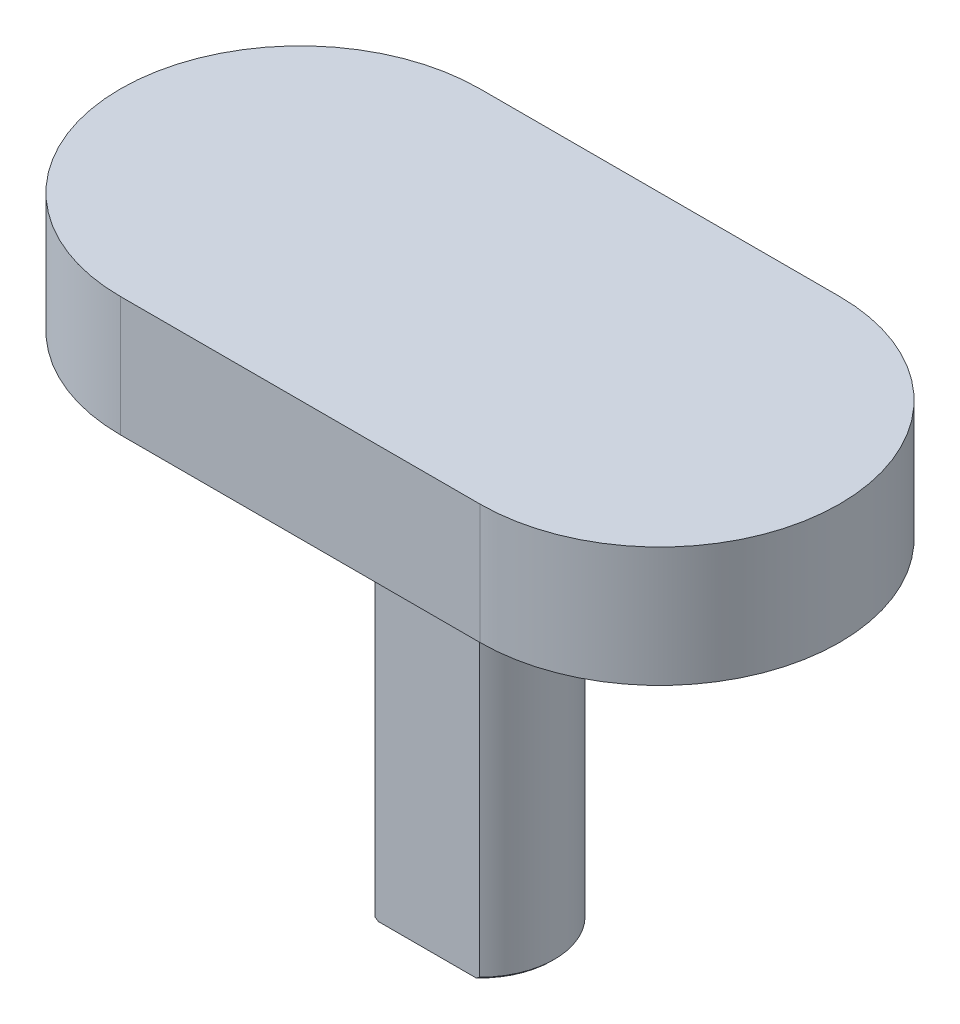
ISO-10303-21;
HEADER;
FILE_DESCRIPTION(('STEP AP214'),'2;1');
FILE_NAME('part.step','',(''),(''),'','','');
FILE_SCHEMA(('AUTOMOTIVE_DESIGN { 1 0 10303 214 1 1 1 1 }'));
ENDSEC;
DATA;
#1=APPLICATION_CONTEXT('core data for automotive mechanical design processes');
#2=APPLICATION_PROTOCOL_DEFINITION('international standard','automotive_design',2000,#1);
#3=PRODUCT_CONTEXT('',#1,'mechanical');
#4=PRODUCT('Part','Part','',(#3));
#5=PRODUCT_RELATED_PRODUCT_CATEGORY('part','',(#4));
#6=PRODUCT_DEFINITION_FORMATION('','',#4);
#7=PRODUCT_DEFINITION_CONTEXT('part definition',#1,'design');
#8=PRODUCT_DEFINITION('design','',#6,#7);
#9=PRODUCT_DEFINITION_SHAPE('','',#8);
#10=(LENGTH_UNIT() NAMED_UNIT(*) SI_UNIT(.MILLI.,.METRE.));
#11=(NAMED_UNIT(*) PLANE_ANGLE_UNIT() SI_UNIT($,.RADIAN.));
#12=(NAMED_UNIT(*) SI_UNIT($,.STERADIAN.) SOLID_ANGLE_UNIT());
#13=UNCERTAINTY_MEASURE_WITH_UNIT(LENGTH_MEASURE(1.E-05),#10,'distance_accuracy_value','');
#14=(GEOMETRIC_REPRESENTATION_CONTEXT(3) GLOBAL_UNCERTAINTY_ASSIGNED_CONTEXT((#13)) GLOBAL_UNIT_ASSIGNED_CONTEXT((#10,
#11,#12)) REPRESENTATION_CONTEXT('',''));
#15=CARTESIAN_POINT('',(0.,0.,0.));
#16=DIRECTION('',(0.,0.,1.));
#17=DIRECTION('',(1.,0.,0.));
#18=AXIS2_PLACEMENT_3D('',#15,#16,#17);
#19=CARTESIAN_POINT('',(75.,40.,0.));
#20=DIRECTION('',(0.,-1.,0.));
#21=DIRECTION('',(0.,0.,-1.));
#22=AXIS2_PLACEMENT_3D('',#19,#20,#21);
#23=PLANE('',#22);
#24=CARTESIAN_POINT('',(75.,40.,0.));
#25=DIRECTION('',(0.,-1.,0.));
#26=DIRECTION('',(0.,0.,-1.));
#27=AXIS2_PLACEMENT_3D('',#24,#25,#26);
#28=CIRCLE('',#27,65.);
#29=CARTESIAN_POINT('',(75.,40.,-65.));
#30=VERTEX_POINT('',#29);
#31=CARTESIAN_POINT('',(75.,40.,65.));
#32=VERTEX_POINT('',#31);
#33=EDGE_CURVE('E300',#30,#32,#28,.T.);
#34=ORIENTED_EDGE('',*,*,#33,.T.);
#35=DIRECTION('',(-1.,0.,0.));
#36=VECTOR('',#35,1.);
#37=CARTESIAN_POINT('',(-75.,40.,65.));
#38=LINE('',#37,#36);
#39=CARTESIAN_POINT('',(-75.,40.,65.));
#40=VERTEX_POINT('',#39);
#41=EDGE_CURVE('E303',#32,#40,#38,.T.);
#42=ORIENTED_EDGE('',*,*,#41,.T.);
#43=CARTESIAN_POINT('',(-75.,40.,0.));
#44=DIRECTION('',(0.,-1.,0.));
#45=DIRECTION('',(0.,0.,-1.));
#46=AXIS2_PLACEMENT_3D('',#43,#44,#45);
#47=CIRCLE('',#46,65.);
#48=CARTESIAN_POINT('',(-75.,40.,-65.));
#49=VERTEX_POINT('',#48);
#50=EDGE_CURVE('E307',#40,#49,#47,.T.);
#51=ORIENTED_EDGE('',*,*,#50,.T.);
#52=DIRECTION('',(1.,0.,0.));
#53=VECTOR('',#52,1.);
#54=CARTESIAN_POINT('',(-75.,40.,-65.));
#55=LINE('',#54,#53);
#56=EDGE_CURVE('E310',#49,#30,#55,.T.);
#57=ORIENTED_EDGE('',*,*,#56,.T.);
#58=EDGE_LOOP('',(#34,#42,#51,#57));
#59=FACE_BOUND('',#58,.T.);
#60=DIRECTION('',(1.,0.,0.));
#61=VECTOR('',#60,1.);
#62=CARTESIAN_POINT('',(-24.9198715887542,40.,-30.));
#63=LINE('',#62,#61);
#64=CARTESIAN_POINT('',(-24.9198715887542,40.,-30.));
#65=VERTEX_POINT('',#64);
#66=CARTESIAN_POINT('',(24.9198715887542,40.,-30.));
#67=VERTEX_POINT('',#66);
#68=EDGE_CURVE('E284',#65,#67,#63,.T.);
#69=ORIENTED_EDGE('',*,*,#68,.F.);
#70=CARTESIAN_POINT('',(0.,40.,0.));
#71=DIRECTION('',(0.,-1.,0.));
#72=DIRECTION('',(0.,0.,-1.));
#73=AXIS2_PLACEMENT_3D('',#70,#71,#72);
#74=CIRCLE('',#73,39.);
#75=CARTESIAN_POINT('',(-24.9198715887542,40.,30.));
#76=VERTEX_POINT('',#75);
#77=EDGE_CURVE('E270',#76,#65,#74,.T.);
#78=ORIENTED_EDGE('',*,*,#77,.F.);
#79=DIRECTION('',(-1.,0.,0.));
#80=VECTOR('',#79,1.);
#81=CARTESIAN_POINT('',(-24.9198715887542,40.,30.));
#82=LINE('',#81,#80);
#83=CARTESIAN_POINT('',(24.9198715887542,40.,30.));
#84=VERTEX_POINT('',#83);
#85=EDGE_CURVE('E275',#84,#76,#82,.T.);
#86=ORIENTED_EDGE('',*,*,#85,.F.);
#87=CARTESIAN_POINT('',(0.,40.,0.));
#88=DIRECTION('',(0.,-1.,0.));
#89=DIRECTION('',(0.,0.,-1.));
#90=AXIS2_PLACEMENT_3D('',#87,#88,#89);
#91=CIRCLE('',#90,39.);
#92=EDGE_CURVE('E286',#67,#84,#91,.T.);
#93=ORIENTED_EDGE('',*,*,#92,.F.);
#94=EDGE_LOOP('',(#69,#78,#86,#93));
#95=FACE_BOUND('',#94,.T.);
#96=ADVANCED_FACE('F44',(#59,#95),#23,.T.);
#97=CARTESIAN_POINT('',(75.,50.,0.));
#98=DIRECTION('',(0.,-1.,0.));
#99=DIRECTION('',(0.,0.,-1.));
#100=AXIS2_PLACEMENT_3D('',#97,#98,#99);
#101=CYLINDRICAL_SURFACE('',#100,75.);
#102=CARTESIAN_POINT('',(75.,0.,0.));
#103=DIRECTION('',(0.,1.,0.));
#104=DIRECTION('',(0.,0.,1.));
#105=AXIS2_PLACEMENT_3D('',#102,#103,#104);
#106=CIRCLE('',#105,75.);
#107=CARTESIAN_POINT('',(75.,0.,75.));
#108=VERTEX_POINT('',#107);
#109=CARTESIAN_POINT('',(75.,0.,-75.));
#110=VERTEX_POINT('',#109);
#111=EDGE_CURVE('E325',#108,#110,#106,.T.);
#112=ORIENTED_EDGE('',*,*,#111,.T.);
#113=DIRECTION('',(0.,-1.,0.));
#114=VECTOR('',#113,1.);
#115=CARTESIAN_POINT('',(75.,50.,-75.));
#116=LINE('',#115,#114);
#117=CARTESIAN_POINT('',(75.,50.,-75.));
#118=VERTEX_POINT('',#117);
#119=EDGE_CURVE('E358',#118,#110,#116,.T.);
#120=ORIENTED_EDGE('',*,*,#119,.F.);
#121=CARTESIAN_POINT('',(75.,50.,0.));
#122=DIRECTION('',(0.,1.,0.));
#123=DIRECTION('',(0.,0.,1.));
#124=AXIS2_PLACEMENT_3D('',#121,#122,#123);
#125=CIRCLE('',#124,75.);
#126=CARTESIAN_POINT('',(75.,50.,75.));
#127=VERTEX_POINT('',#126);
#128=EDGE_CURVE('E332',#127,#118,#125,.T.);
#129=ORIENTED_EDGE('',*,*,#128,.F.);
#130=DIRECTION('',(0.,-1.,0.));
#131=VECTOR('',#130,1.);
#132=CARTESIAN_POINT('',(75.,50.,75.));
#133=LINE('',#132,#131);
#134=EDGE_CURVE('E342',#127,#108,#133,.T.);
#135=ORIENTED_EDGE('',*,*,#134,.T.);
#136=EDGE_LOOP('',(#112,#120,#129,#135));
#137=FACE_BOUND('',#136,.T.);
#138=ADVANCED_FACE('F416',(#137),#101,.T.);
#139=CARTESIAN_POINT('',(-75.,50.,-75.));
#140=DIRECTION('',(0.,0.,1.));
#141=DIRECTION('',(1.,0.,0.));
#142=AXIS2_PLACEMENT_3D('',#139,#140,#141);
#143=PLANE('',#142);
#144=DIRECTION('',(-1.,0.,0.));
#145=VECTOR('',#144,1.);
#146=CARTESIAN_POINT('',(-75.,0.,-75.));
#147=LINE('',#146,#145);
#148=CARTESIAN_POINT('',(-75.,0.,-75.));
#149=VERTEX_POINT('',#148);
#150=EDGE_CURVE('E345',#110,#149,#147,.T.);
#151=ORIENTED_EDGE('',*,*,#150,.T.);
#152=DIRECTION('',(0.,-1.,0.));
#153=VECTOR('',#152,1.);
#154=CARTESIAN_POINT('',(-75.,50.,-75.));
#155=LINE('',#154,#153);
#156=CARTESIAN_POINT('',(-75.,50.,-75.));
#157=VERTEX_POINT('',#156);
#158=EDGE_CURVE('E355',#157,#149,#155,.T.);
#159=ORIENTED_EDGE('',*,*,#158,.F.);
#160=DIRECTION('',(-1.,0.,0.));
#161=VECTOR('',#160,1.);
#162=CARTESIAN_POINT('',(-75.,50.,-75.));
#163=LINE('',#162,#161);
#164=EDGE_CURVE('E335',#118,#157,#163,.T.);
#165=ORIENTED_EDGE('',*,*,#164,.F.);
#166=ORIENTED_EDGE('',*,*,#119,.T.);
#167=EDGE_LOOP('',(#151,#159,#165,#166));
#168=FACE_BOUND('',#167,.T.);
#169=ADVANCED_FACE('F420',(#168),#143,.F.);
#170=CARTESIAN_POINT('',(-75.,50.,0.));
#171=DIRECTION('',(0.,-1.,0.));
#172=DIRECTION('',(0.,0.,-1.));
#173=AXIS2_PLACEMENT_3D('',#170,#171,#172);
#174=CYLINDRICAL_SURFACE('',#173,75.);
#175=CARTESIAN_POINT('',(-75.,0.,0.));
#176=DIRECTION('',(0.,1.,0.));
#177=DIRECTION('',(0.,0.,1.));
#178=AXIS2_PLACEMENT_3D('',#175,#176,#177);
#179=CIRCLE('',#178,75.);
#180=CARTESIAN_POINT('',(-75.,0.,75.));
#181=VERTEX_POINT('',#180);
#182=EDGE_CURVE('E347',#149,#181,#179,.T.);
#183=ORIENTED_EDGE('',*,*,#182,.T.);
#184=DIRECTION('',(0.,-1.,0.));
#185=VECTOR('',#184,1.);
#186=CARTESIAN_POINT('',(-75.,50.,75.));
#187=LINE('',#186,#185);
#188=CARTESIAN_POINT('',(-75.,50.,75.));
#189=VERTEX_POINT('',#188);
#190=EDGE_CURVE('E352',#189,#181,#187,.T.);
#191=ORIENTED_EDGE('',*,*,#190,.F.);
#192=CARTESIAN_POINT('',(-75.,50.,0.));
#193=DIRECTION('',(0.,1.,0.));
#194=DIRECTION('',(0.,0.,1.));
#195=AXIS2_PLACEMENT_3D('',#192,#193,#194);
#196=CIRCLE('',#195,75.);
#197=EDGE_CURVE('E338',#157,#189,#196,.T.);
#198=ORIENTED_EDGE('',*,*,#197,.F.);
#199=ORIENTED_EDGE('',*,*,#158,.T.);
#200=EDGE_LOOP('',(#183,#191,#198,#199));
#201=FACE_BOUND('',#200,.T.);
#202=ADVANCED_FACE('F424',(#201),#174,.T.);
#203=CARTESIAN_POINT('',(-75.,50.,75.));
#204=DIRECTION('',(0.,0.,-1.));
#205=DIRECTION('',(-1.,0.,0.));
#206=AXIS2_PLACEMENT_3D('',#203,#204,#205);
#207=PLANE('',#206);
#208=DIRECTION('',(1.,0.,0.));
#209=VECTOR('',#208,1.);
#210=CARTESIAN_POINT('',(-75.,0.,75.));
#211=LINE('',#210,#209);
#212=EDGE_CURVE('E336',#181,#108,#211,.T.);
#213=ORIENTED_EDGE('',*,*,#212,.T.);
#214=ORIENTED_EDGE('',*,*,#134,.F.);
#215=DIRECTION('',(1.,0.,0.));
#216=VECTOR('',#215,1.);
#217=CARTESIAN_POINT('',(-75.,50.,75.));
#218=LINE('',#217,#216);
#219=EDGE_CURVE('E340',#189,#127,#218,.T.);
#220=ORIENTED_EDGE('',*,*,#219,.F.);
#221=ORIENTED_EDGE('',*,*,#190,.T.);
#222=EDGE_LOOP('',(#213,#214,#220,#221));
#223=FACE_BOUND('',#222,.T.);
#224=ADVANCED_FACE('F428',(#223),#207,.F.);
#225=CARTESIAN_POINT('',(75.,50.,0.));
#226=DIRECTION('',(0.,1.,0.));
#227=DIRECTION('',(0.,0.,1.));
#228=AXIS2_PLACEMENT_3D('',#225,#226,#227);
#229=PLANE('',#228);
#230=ORIENTED_EDGE('',*,*,#128,.T.);
#231=ORIENTED_EDGE('',*,*,#164,.T.);
#232=ORIENTED_EDGE('',*,*,#197,.T.);
#233=ORIENTED_EDGE('',*,*,#219,.T.);
#234=EDGE_LOOP('',(#230,#231,#232,#233));
#235=FACE_BOUND('',#234,.T.);
#236=ADVANCED_FACE('F432',(#235),#229,.T.);
#237=CARTESIAN_POINT('',(75.,0.,0.));
#238=DIRECTION('',(0.,1.,0.));
#239=DIRECTION('',(0.,0.,1.));
#240=AXIS2_PLACEMENT_3D('',#237,#238,#239);
#241=PLANE('',#240);
#242=DIRECTION('',(-1.,0.,0.));
#243=VECTOR('',#242,1.);
#244=CARTESIAN_POINT('',(-75.,0.,65.));
#245=LINE('',#244,#243);
#246=CARTESIAN_POINT('',(75.,0.,65.));
#247=VERTEX_POINT('',#246);
#248=CARTESIAN_POINT('',(-75.,0.,65.));
#249=VERTEX_POINT('',#248);
#250=EDGE_CURVE('E315',#247,#249,#245,.T.);
#251=ORIENTED_EDGE('',*,*,#250,.F.);
#252=CARTESIAN_POINT('',(75.,0.,0.));
#253=DIRECTION('',(0.,-1.,0.));
#254=DIRECTION('',(0.,0.,-1.));
#255=AXIS2_PLACEMENT_3D('',#252,#253,#254);
#256=CIRCLE('',#255,65.);
#257=CARTESIAN_POINT('',(75.,0.,-65.));
#258=VERTEX_POINT('',#257);
#259=EDGE_CURVE('E299',#258,#247,#256,.T.);
#260=ORIENTED_EDGE('',*,*,#259,.F.);
#261=DIRECTION('',(1.,0.,0.));
#262=VECTOR('',#261,1.);
#263=CARTESIAN_POINT('',(-75.,0.,-65.));
#264=LINE('',#263,#262);
#265=CARTESIAN_POINT('',(-75.,0.,-65.));
#266=VERTEX_POINT('',#265);
#267=EDGE_CURVE('E304',#266,#258,#264,.T.);
#268=ORIENTED_EDGE('',*,*,#267,.F.);
#269=CARTESIAN_POINT('',(-75.,0.,0.));
#270=DIRECTION('',(0.,-1.,0.));
#271=DIRECTION('',(0.,0.,-1.));
#272=AXIS2_PLACEMENT_3D('',#269,#270,#271);
#273=CIRCLE('',#272,65.);
#274=EDGE_CURVE('E318',#249,#266,#273,.T.);
#275=ORIENTED_EDGE('',*,*,#274,.F.);
#276=EDGE_LOOP('',(#251,#260,#268,#275));
#277=FACE_BOUND('',#276,.T.);
#278=ORIENTED_EDGE('',*,*,#111,.F.);
#279=ORIENTED_EDGE('',*,*,#212,.F.);
#280=ORIENTED_EDGE('',*,*,#182,.F.);
#281=ORIENTED_EDGE('',*,*,#150,.F.);
#282=EDGE_LOOP('',(#278,#279,#280,#281));
#283=FACE_BOUND('',#282,.T.);
#284=ADVANCED_FACE('F434',(#277,#283),#241,.F.);
#285=CARTESIAN_POINT('',(75.,40.,0.));
#286=DIRECTION('',(0.,-1.,0.));
#287=DIRECTION('',(0.,0.,-1.));
#288=AXIS2_PLACEMENT_3D('',#285,#286,#287);
#289=CYLINDRICAL_SURFACE('',#288,65.);
#290=ORIENTED_EDGE('',*,*,#259,.T.);
#291=DIRECTION('',(0.,-1.,0.));
#292=VECTOR('',#291,1.);
#293=CARTESIAN_POINT('',(75.,40.,65.));
#294=LINE('',#293,#292);
#295=EDGE_CURVE('E313',#32,#247,#294,.T.);
#296=ORIENTED_EDGE('',*,*,#295,.F.);
#297=ORIENTED_EDGE('',*,*,#33,.F.);
#298=DIRECTION('',(0.,-1.,0.));
#299=VECTOR('',#298,1.);
#300=CARTESIAN_POINT('',(75.,40.,-65.));
#301=LINE('',#300,#299);
#302=EDGE_CURVE('E323',#30,#258,#301,.T.);
#303=ORIENTED_EDGE('',*,*,#302,.T.);
#304=EDGE_LOOP('',(#290,#296,#297,#303));
#305=FACE_BOUND('',#304,.T.);
#306=ADVANCED_FACE('F437',(#305),#289,.F.);
#307=CARTESIAN_POINT('',(-75.,40.,-65.));
#308=DIRECTION('',(0.,0.,-1.));
#309=DIRECTION('',(-1.,0.,0.));
#310=AXIS2_PLACEMENT_3D('',#307,#308,#309);
#311=PLANE('',#310);
#312=ORIENTED_EDGE('',*,*,#267,.T.);
#313=ORIENTED_EDGE('',*,*,#302,.F.);
#314=ORIENTED_EDGE('',*,*,#56,.F.);
#315=DIRECTION('',(0.,-1.,0.));
#316=VECTOR('',#315,1.);
#317=CARTESIAN_POINT('',(-75.,40.,-65.));
#318=LINE('',#317,#316);
#319=EDGE_CURVE('E326',#49,#266,#318,.T.);
#320=ORIENTED_EDGE('',*,*,#319,.T.);
#321=EDGE_LOOP('',(#312,#313,#314,#320));
#322=FACE_BOUND('',#321,.T.);
#323=ADVANCED_FACE('F444',(#322),#311,.F.);
#324=CARTESIAN_POINT('',(-75.,40.,0.));
#325=DIRECTION('',(0.,-1.,0.));
#326=DIRECTION('',(0.,0.,-1.));
#327=AXIS2_PLACEMENT_3D('',#324,#325,#326);
#328=CYLINDRICAL_SURFACE('',#327,65.);
#329=ORIENTED_EDGE('',*,*,#274,.T.);
#330=ORIENTED_EDGE('',*,*,#319,.F.);
#331=ORIENTED_EDGE('',*,*,#50,.F.);
#332=DIRECTION('',(0.,-1.,0.));
#333=VECTOR('',#332,1.);
#334=CARTESIAN_POINT('',(-75.,40.,65.));
#335=LINE('',#334,#333);
#336=EDGE_CURVE('E328',#40,#249,#335,.T.);
#337=ORIENTED_EDGE('',*,*,#336,.T.);
#338=EDGE_LOOP('',(#329,#330,#331,#337));
#339=FACE_BOUND('',#338,.T.);
#340=ADVANCED_FACE('F450',(#339),#328,.F.);
#341=CARTESIAN_POINT('',(-75.,40.,65.));
#342=DIRECTION('',(0.,0.,1.));
#343=DIRECTION('',(1.,0.,0.));
#344=AXIS2_PLACEMENT_3D('',#341,#342,#343);
#345=PLANE('',#344);
#346=ORIENTED_EDGE('',*,*,#250,.T.);
#347=ORIENTED_EDGE('',*,*,#336,.F.);
#348=ORIENTED_EDGE('',*,*,#41,.F.);
#349=ORIENTED_EDGE('',*,*,#295,.T.);
#350=EDGE_LOOP('',(#346,#347,#348,#349));
#351=FACE_BOUND('',#350,.T.);
#352=ADVANCED_FACE('F446',(#351),#345,.F.);
#353=CARTESIAN_POINT('',(0.,20.,0.));
#354=DIRECTION('',(0.,1.,0.));
#355=DIRECTION('',(0.,0.,1.));
#356=AXIS2_PLACEMENT_3D('',#353,#354,#355);
#357=CYLINDRICAL_SURFACE('',#356,39.);
#358=ORIENTED_EDGE('',*,*,#77,.T.);
#359=DIRECTION('',(0.,1.,0.));
#360=VECTOR('',#359,1.);
#361=CARTESIAN_POINT('',(-24.9198715887542,20.,-30.));
#362=LINE('',#361,#360);
#363=CARTESIAN_POINT('',(-24.9198715887542,20.,-30.));
#364=VERTEX_POINT('',#363);
#365=EDGE_CURVE('E297',#364,#65,#362,.T.);
#366=ORIENTED_EDGE('',*,*,#365,.F.);
#367=CARTESIAN_POINT('',(0.,20.,0.));
#368=DIRECTION('',(0.,-1.,0.));
#369=DIRECTION('',(0.,0.,-1.));
#370=AXIS2_PLACEMENT_3D('',#367,#368,#369);
#371=CIRCLE('',#370,39.);
#372=CARTESIAN_POINT('',(-24.9198715887542,20.,30.));
#373=VERTEX_POINT('',#372);
#374=EDGE_CURVE('E271',#373,#364,#371,.T.);
#375=ORIENTED_EDGE('',*,*,#374,.F.);
#376=DIRECTION('',(0.,1.,0.));
#377=VECTOR('',#376,1.);
#378=CARTESIAN_POINT('',(-24.9198715887542,20.,30.));
#379=LINE('',#378,#377);
#380=EDGE_CURVE('E281',#373,#76,#379,.T.);
#381=ORIENTED_EDGE('',*,*,#380,.T.);
#382=EDGE_LOOP('',(#358,#366,#375,#381));
#383=FACE_BOUND('',#382,.T.);
#384=ADVANCED_FACE('F449',(#383),#357,.T.);
#385=CARTESIAN_POINT('',(-24.9198715887542,20.,-30.));
#386=DIRECTION('',(0.,0.,1.));
#387=DIRECTION('',(1.,0.,0.));
#388=AXIS2_PLACEMENT_3D('',#385,#386,#387);
#389=PLANE('',#388);
#390=ORIENTED_EDGE('',*,*,#68,.T.);
#391=DIRECTION('',(0.,1.,0.));
#392=VECTOR('',#391,1.);
#393=CARTESIAN_POINT('',(24.9198715887542,20.,-30.));
#394=LINE('',#393,#392);
#395=CARTESIAN_POINT('',(24.9198715887542,20.,-30.));
#396=VERTEX_POINT('',#395);
#397=EDGE_CURVE('E294',#396,#67,#394,.T.);
#398=ORIENTED_EDGE('',*,*,#397,.F.);
#399=DIRECTION('',(1.,0.,0.));
#400=VECTOR('',#399,1.);
#401=CARTESIAN_POINT('',(-24.9198715887542,20.,-30.));
#402=LINE('',#401,#400);
#403=EDGE_CURVE('E274',#364,#396,#402,.T.);
#404=ORIENTED_EDGE('',*,*,#403,.F.);
#405=ORIENTED_EDGE('',*,*,#365,.T.);
#406=EDGE_LOOP('',(#390,#398,#404,#405));
#407=FACE_BOUND('',#406,.T.);
#408=ADVANCED_FACE('F463',(#407),#389,.F.);
#409=CARTESIAN_POINT('',(0.,20.,0.));
#410=DIRECTION('',(0.,1.,0.));
#411=DIRECTION('',(0.,0.,1.));
#412=AXIS2_PLACEMENT_3D('',#409,#410,#411);
#413=CYLINDRICAL_SURFACE('',#412,39.);
#414=ORIENTED_EDGE('',*,*,#92,.T.);
#415=DIRECTION('',(0.,1.,0.));
#416=VECTOR('',#415,1.);
#417=CARTESIAN_POINT('',(24.9198715887542,20.,30.));
#418=LINE('',#417,#416);
#419=CARTESIAN_POINT('',(24.9198715887542,20.,30.));
#420=VERTEX_POINT('',#419);
#421=EDGE_CURVE('E292',#420,#84,#418,.T.);
#422=ORIENTED_EDGE('',*,*,#421,.F.);
#423=CARTESIAN_POINT('',(0.,20.,0.));
#424=DIRECTION('',(0.,-1.,0.));
#425=DIRECTION('',(0.,0.,-1.));
#426=AXIS2_PLACEMENT_3D('',#423,#424,#425);
#427=CIRCLE('',#426,39.);
#428=EDGE_CURVE('E277',#396,#420,#427,.T.);
#429=ORIENTED_EDGE('',*,*,#428,.F.);
#430=ORIENTED_EDGE('',*,*,#397,.T.);
#431=EDGE_LOOP('',(#414,#422,#429,#430));
#432=FACE_BOUND('',#431,.T.);
#433=ADVANCED_FACE('F467',(#432),#413,.T.);
#434=CARTESIAN_POINT('',(-24.9198715887542,20.,30.));
#435=DIRECTION('',(0.,0.,-1.));
#436=DIRECTION('',(-1.,0.,0.));
#437=AXIS2_PLACEMENT_3D('',#434,#435,#436);
#438=PLANE('',#437);
#439=ORIENTED_EDGE('',*,*,#85,.T.);
#440=ORIENTED_EDGE('',*,*,#380,.F.);
#441=DIRECTION('',(-1.,0.,0.));
#442=VECTOR('',#441,1.);
#443=CARTESIAN_POINT('',(-24.9198715887542,20.,30.));
#444=LINE('',#443,#442);
#445=EDGE_CURVE('E279',#420,#373,#444,.T.);
#446=ORIENTED_EDGE('',*,*,#445,.F.);
#447=ORIENTED_EDGE('',*,*,#421,.T.);
#448=EDGE_LOOP('',(#439,#440,#446,#447));
#449=FACE_BOUND('',#448,.T.);
#450=ADVANCED_FACE('F471',(#449),#438,.F.);
#451=CARTESIAN_POINT('',(0.,20.,0.));
#452=DIRECTION('',(0.,-1.,0.));
#453=DIRECTION('',(0.,0.,-1.));
#454=AXIS2_PLACEMENT_3D('',#451,#452,#453);
#455=PLANE('',#454);
#456=CARTESIAN_POINT('',(0.,20.,0.));
#457=DIRECTION('',(0.,-1.,0.));
#458=DIRECTION('',(0.,0.,-1.));
#459=AXIS2_PLACEMENT_3D('',#456,#457,#458);
#460=CIRCLE('',#459,31.);
#461=CARTESIAN_POINT('',(-21.8403296678416,20.,22.));
#462=VERTEX_POINT('',#461);
#463=CARTESIAN_POINT('',(-21.8403296678416,20.,-22.));
#464=VERTEX_POINT('',#463);
#465=EDGE_CURVE('E244',#462,#464,#460,.T.);
#466=ORIENTED_EDGE('',*,*,#465,.F.);
#467=DIRECTION('',(-1.,0.,0.));
#468=VECTOR('',#467,1.);
#469=CARTESIAN_POINT('',(-21.8403296678416,20.,22.));
#470=LINE('',#469,#468);
#471=CARTESIAN_POINT('',(21.8403296678416,20.,22.));
#472=VERTEX_POINT('',#471);
#473=EDGE_CURVE('E249',#472,#462,#470,.T.);
#474=ORIENTED_EDGE('',*,*,#473,.F.);
#475=CARTESIAN_POINT('',(0.,20.,0.));
#476=DIRECTION('',(0.,-1.,0.));
#477=DIRECTION('',(0.,0.,-1.));
#478=AXIS2_PLACEMENT_3D('',#475,#476,#477);
#479=CIRCLE('',#478,31.);
#480=CARTESIAN_POINT('',(21.8403296678416,20.,-22.));
#481=VERTEX_POINT('',#480);
#482=EDGE_CURVE('E258',#481,#472,#479,.T.);
#483=ORIENTED_EDGE('',*,*,#482,.F.);
#484=DIRECTION('',(1.,0.,0.));
#485=VECTOR('',#484,1.);
#486=CARTESIAN_POINT('',(-21.8403296678416,20.,-22.));
#487=LINE('',#486,#485);
#488=EDGE_CURVE('E255',#464,#481,#487,.T.);
#489=ORIENTED_EDGE('',*,*,#488,.F.);
#490=EDGE_LOOP('',(#466,#474,#483,#489));
#491=FACE_BOUND('',#490,.T.);
#492=ORIENTED_EDGE('',*,*,#374,.T.);
#493=ORIENTED_EDGE('',*,*,#403,.T.);
#494=ORIENTED_EDGE('',*,*,#428,.T.);
#495=ORIENTED_EDGE('',*,*,#445,.T.);
#496=EDGE_LOOP('',(#492,#493,#494,#495));
#497=FACE_BOUND('',#496,.T.);
#498=ADVANCED_FACE('F474',(#491,#497),#455,.T.);
#499=CARTESIAN_POINT('',(0.,-175.,0.));
#500=DIRECTION('',(0.,1.,0.));
#501=DIRECTION('',(0.,0.,1.));
#502=AXIS2_PLACEMENT_3D('',#499,#500,#501);
#503=CYLINDRICAL_SURFACE('',#502,31.);
#504=DIRECTION('',(0.,1.,0.));
#505=VECTOR('',#504,1.);
#506=CARTESIAN_POINT('',(-21.8403296678416,-175.,-22.));
#507=LINE('',#506,#505);
#508=CARTESIAN_POINT('',(-21.8403296678416,-174.,-22.));
#509=VERTEX_POINT('',#508);
#510=EDGE_CURVE('E268',#509,#464,#507,.T.);
#511=ORIENTED_EDGE('',*,*,#510,.F.);
#512=CARTESIAN_POINT('',(0.,-174.,0.));
#513=DIRECTION('',(0.,-1.,0.));
#514=DIRECTION('',(0.,0.,-1.));
#515=AXIS2_PLACEMENT_3D('',#512,#513,#514);
#516=CIRCLE('',#515,31.);
#517=CARTESIAN_POINT('',(-21.8403296678416,-174.,22.));
#518=VERTEX_POINT('',#517);
#519=EDGE_CURVE('E11',#509,#518,#516,.F.);
#520=ORIENTED_EDGE('',*,*,#519,.T.);
#521=DIRECTION('',(0.,1.,0.));
#522=VECTOR('',#521,1.);
#523=CARTESIAN_POINT('',(-21.8403296678416,-175.,22.));
#524=LINE('',#523,#522);
#525=EDGE_CURVE('E252',#518,#462,#524,.T.);
#526=ORIENTED_EDGE('',*,*,#525,.T.);
#527=ORIENTED_EDGE('',*,*,#465,.T.);
#528=EDGE_LOOP('',(#511,#520,#526,#527));
#529=FACE_BOUND('',#528,.T.);
#530=ADVANCED_FACE('F396',(#529),#503,.T.);
#531=CARTESIAN_POINT('',(-21.8403296678416,-175.,-22.));
#532=DIRECTION('',(0.,0.,1.));
#533=DIRECTION('',(1.,0.,0.));
#534=AXIS2_PLACEMENT_3D('',#531,#532,#533);
#535=PLANE('',#534);
#536=DIRECTION('',(0.,1.,0.));
#537=VECTOR('',#536,1.);
#538=CARTESIAN_POINT('',(21.8403296678416,-175.,-22.));
#539=LINE('',#538,#537);
#540=CARTESIAN_POINT('',(21.8403296678416,-174.,-22.));
#541=VERTEX_POINT('',#540);
#542=EDGE_CURVE('E266',#541,#481,#539,.T.);
#543=ORIENTED_EDGE('',*,*,#542,.F.);
#544=CARTESIAN_POINT('',(21.8403296678416,-174.,-22.));
#545=CARTESIAN_POINT('',(21.7206561571541,-174.084313032063,-22.));
#546=CARTESIAN_POINT('',(21.6008184029169,-174.168393078064,-22.));
#547=CARTESIAN_POINT('',(21.360807233521,-174.336068243713,-22.));
#548=CARTESIAN_POINT('',(21.2406338242239,-174.419663371753,-22.));
#549=CARTESIAN_POINT('',(20.9999399143109,-174.586352746551,-22.));
#550=CARTESIAN_POINT('',(20.8794194133974,-174.669446992881,-22.));
#551=CARTESIAN_POINT('',(20.638019680123,-174.8351172381,-22.));
#552=CARTESIAN_POINT('',(20.517140441572,-174.917693227969,-22.));
#553=CARTESIAN_POINT('',(20.3960780543713,-175.,-22.));
#554=B_SPLINE_CURVE_WITH_KNOTS('',3,(#544,#545,#546,#547,#548,#549,#550,#551,#552,#553),
.UNSPECIFIED.,.F.,.F.,(4,2,2,2,4),(0.,0.439173982914194,0.878340343675406,1.31750708100382,
1.75668144061749),.UNSPECIFIED.);
#555=CARTESIAN_POINT('',(20.3960780543712,-175.,-22.));
#556=VERTEX_POINT('',#555);
#557=EDGE_CURVE('E54',#541,#556,#554,.T.);
#558=ORIENTED_EDGE('',*,*,#557,.T.);
#559=DIRECTION('',(1.,0.,0.));
#560=VECTOR('',#559,1.);
#561=CARTESIAN_POINT('',(-21.8403296678416,-175.,-22.));
#562=LINE('',#561,#560);
#563=CARTESIAN_POINT('',(-20.3960780543713,-175.,-22.));
#564=VERTEX_POINT('',#563);
#565=EDGE_CURVE('E245',#564,#556,#562,.T.);
#566=ORIENTED_EDGE('',*,*,#565,.F.);
#567=CARTESIAN_POINT('',(-20.3960780543713,-175.,-22.));
#568=CARTESIAN_POINT('',(-20.517140441572,-174.917693227969,-22.));
#569=CARTESIAN_POINT('',(-20.6380196801229,-174.835117238099,-22.));
#570=CARTESIAN_POINT('',(-20.8794194133974,-174.669446992881,-22.));
#571=CARTESIAN_POINT('',(-20.9999399143109,-174.586352746551,-22.));
#572=CARTESIAN_POINT('',(-21.2406338242239,-174.419663371753,-22.));
#573=CARTESIAN_POINT('',(-21.360807233521,-174.336068243713,-22.));
#574=CARTESIAN_POINT('',(-21.6008184029169,-174.168393078064,-22.));
#575=CARTESIAN_POINT('',(-21.7206561571541,-174.084313032063,-22.));
#576=CARTESIAN_POINT('',(-21.8403296678415,-174.,-22.));
#577=B_SPLINE_CURVE_WITH_KNOTS('',3,(#567,#568,#569,#570,#571,#572,#573,#574,#575,#576),
.UNSPECIFIED.,.F.,.F.,(4,2,2,2,4),(0.,0.439174359613653,0.878341096942059,1.3175074577033,
1.75668144061749),.UNSPECIFIED.);
#578=EDGE_CURVE('E61',#564,#509,#577,.T.);
#579=ORIENTED_EDGE('',*,*,#578,.T.);
#580=ORIENTED_EDGE('',*,*,#510,.T.);
#581=ORIENTED_EDGE('',*,*,#488,.T.);
#582=EDGE_LOOP('',(#543,#558,#566,#579,#580,#581));
#583=FACE_BOUND('',#582,.T.);
#584=ADVANCED_FACE('F392',(#583),#535,.F.);
#585=CARTESIAN_POINT('',(0.,-175.,0.));
#586=DIRECTION('',(0.,1.,0.));
#587=DIRECTION('',(0.,0.,1.));
#588=AXIS2_PLACEMENT_3D('',#585,#586,#587);
#589=CYLINDRICAL_SURFACE('',#588,31.);
#590=DIRECTION('',(0.,1.,0.));
#591=VECTOR('',#590,1.);
#592=CARTESIAN_POINT('',(21.8403296678416,-175.,22.));
#593=LINE('',#592,#591);
#594=CARTESIAN_POINT('',(21.8403296678416,-174.,22.));
#595=VERTEX_POINT('',#594);
#596=EDGE_CURVE('E264',#595,#472,#593,.T.);
#597=ORIENTED_EDGE('',*,*,#596,.F.);
#598=CARTESIAN_POINT('',(0.,-174.,0.));
#599=DIRECTION('',(0.,-1.,0.));
#600=DIRECTION('',(0.,0.,-1.));
#601=AXIS2_PLACEMENT_3D('',#598,#599,#600);
#602=CIRCLE('',#601,31.);
#603=EDGE_CURVE('E69',#595,#541,#602,.F.);
#604=ORIENTED_EDGE('',*,*,#603,.T.);
#605=ORIENTED_EDGE('',*,*,#542,.T.);
#606=ORIENTED_EDGE('',*,*,#482,.T.);
#607=EDGE_LOOP('',(#597,#604,#605,#606));
#608=FACE_BOUND('',#607,.T.);
#609=ADVANCED_FACE('F386',(#608),#589,.T.);
#610=CARTESIAN_POINT('',(-21.8403296678416,-175.,22.));
#611=DIRECTION('',(0.,0.,-1.));
#612=DIRECTION('',(-1.,0.,0.));
#613=AXIS2_PLACEMENT_3D('',#610,#611,#612);
#614=PLANE('',#613);
#615=DIRECTION('',(-1.,0.,0.));
#616=VECTOR('',#615,1.);
#617=CARTESIAN_POINT('',(-21.8403296678416,-175.,22.));
#618=LINE('',#617,#616);
#619=CARTESIAN_POINT('',(20.3960780543712,-175.,22.));
#620=VERTEX_POINT('',#619);
#621=CARTESIAN_POINT('',(-20.3960780543713,-175.,22.));
#622=VERTEX_POINT('',#621);
#623=EDGE_CURVE('E248',#620,#622,#618,.T.);
#624=ORIENTED_EDGE('',*,*,#623,.F.);
#625=CARTESIAN_POINT('',(20.3960780543713,-175.,22.));
#626=CARTESIAN_POINT('',(20.517140441572,-174.917693227969,22.));
#627=CARTESIAN_POINT('',(20.6380196801229,-174.835117238099,22.));
#628=CARTESIAN_POINT('',(20.8794194133974,-174.669446992881,22.));
#629=CARTESIAN_POINT('',(20.9999399143109,-174.586352746551,22.));
#630=CARTESIAN_POINT('',(21.2406338242239,-174.419663371753,22.));
#631=CARTESIAN_POINT('',(21.360807233521,-174.336068243713,22.));
#632=CARTESIAN_POINT('',(21.6008184029169,-174.168393078064,22.));
#633=CARTESIAN_POINT('',(21.720656157154,-174.084313032063,22.));
#634=CARTESIAN_POINT('',(21.8403296678415,-174.,22.));
#635=B_SPLINE_CURVE_WITH_KNOTS('',3,(#625,#626,#627,#628,#629,#630,#631,#632,#633,#634),
.UNSPECIFIED.,.F.,.F.,(4,2,2,2,4),(0.,0.439174359613656,0.878341096942064,1.3175074577033,
1.75668144061749),.UNSPECIFIED.);
#636=EDGE_CURVE('E374',#620,#595,#635,.T.);
#637=ORIENTED_EDGE('',*,*,#636,.T.);
#638=ORIENTED_EDGE('',*,*,#596,.T.);
#639=ORIENTED_EDGE('',*,*,#473,.T.);
#640=ORIENTED_EDGE('',*,*,#525,.F.);
#641=CARTESIAN_POINT('',(-21.8403296678416,-174.,22.));
#642=CARTESIAN_POINT('',(-21.7206561571541,-174.084313032063,22.));
#643=CARTESIAN_POINT('',(-21.6008184029169,-174.168393078064,22.));
#644=CARTESIAN_POINT('',(-21.360807233521,-174.336068243713,22.));
#645=CARTESIAN_POINT('',(-21.2406338242239,-174.419663371753,22.));
#646=CARTESIAN_POINT('',(-20.9999399143109,-174.586352746551,22.));
#647=CARTESIAN_POINT('',(-20.8794194133974,-174.669446992881,22.));
#648=CARTESIAN_POINT('',(-20.638019680123,-174.8351172381,22.));
#649=CARTESIAN_POINT('',(-20.517140441572,-174.917693227969,22.));
#650=CARTESIAN_POINT('',(-20.3960780543713,-175.,22.));
#651=B_SPLINE_CURVE_WITH_KNOTS('',3,(#641,#642,#643,#644,#645,#646,#647,#648,#649,#650),
.UNSPECIFIED.,.F.,.F.,(4,2,2,2,4),(0.,0.439173982914194,0.878340343675406,1.31750708100382,
1.75668144061749),.UNSPECIFIED.);
#652=EDGE_CURVE('E367',#518,#622,#651,.T.);
#653=ORIENTED_EDGE('',*,*,#652,.T.);
#654=EDGE_LOOP('',(#624,#637,#638,#639,#640,#653));
#655=FACE_BOUND('',#654,.T.);
#656=ADVANCED_FACE('F380',(#655),#614,.F.);
#657=CARTESIAN_POINT('',(0.,-175.,0.));
#658=DIRECTION('',(0.,-1.,0.));
#659=DIRECTION('',(0.,0.,-1.));
#660=AXIS2_PLACEMENT_3D('',#657,#658,#659);
#661=PLANE('',#660);
#662=CARTESIAN_POINT('',(-24.5,-175.,1.71082585603314E-13));
#663=DIRECTION('',(0.,-1.,0.));
#664=DIRECTION('',(0.,0.,-1.));
#665=AXIS2_PLACEMENT_3D('',#662,#663,#664);
#666=CIRCLE('',#665,2.5);
#667=CARTESIAN_POINT('',(-24.5,-175.,-2.49999999999983));
#668=VERTEX_POINT('',#667);
#669=EDGE_CURVE('E198',#668,#668,#666,.T.);
#670=ORIENTED_EDGE('',*,*,#669,.F.);
#671=EDGE_LOOP('',(#670));
#672=FACE_BOUND('',#671,.T.);
#673=CARTESIAN_POINT('',(-17.3241161390703,-175.,17.3241161390706));
#674=DIRECTION('',(0.,-1.,0.));
#675=DIRECTION('',(0.,0.,-1.));
#676=AXIS2_PLACEMENT_3D('',#673,#674,#675);
#677=CIRCLE('',#676,2.5);
#678=CARTESIAN_POINT('',(-17.3241161390703,-175.,14.8241161390706));
#679=VERTEX_POINT('',#678);
#680=EDGE_CURVE('E197',#679,#679,#677,.T.);
#681=ORIENTED_EDGE('',*,*,#680,.F.);
#682=EDGE_LOOP('',(#681));
#683=FACE_BOUND('',#682,.T.);
#684=CARTESIAN_POINT('',(17.3241161390706,-175.,17.3241161390702));
#685=DIRECTION('',(0.,-1.,0.));
#686=DIRECTION('',(0.,0.,-1.));
#687=AXIS2_PLACEMENT_3D('',#684,#685,#686);
#688=CIRCLE('',#687,2.5);
#689=CARTESIAN_POINT('',(17.3241161390706,-175.,14.8241161390702));
#690=VERTEX_POINT('',#689);
#691=EDGE_CURVE('E208',#690,#690,#688,.T.);
#692=ORIENTED_EDGE('',*,*,#691,.F.);
#693=EDGE_LOOP('',(#692));
#694=FACE_BOUND('',#693,.T.);
#695=CARTESIAN_POINT('',(24.5,-175.,0.));
#696=DIRECTION('',(0.,-1.,0.));
#697=DIRECTION('',(0.,0.,-1.));
#698=AXIS2_PLACEMENT_3D('',#695,#696,#697);
#699=CIRCLE('',#698,2.5);
#700=CARTESIAN_POINT('',(24.5,-175.,-2.5));
#701=VERTEX_POINT('',#700);
#702=EDGE_CURVE('E214',#701,#701,#699,.T.);
#703=ORIENTED_EDGE('',*,*,#702,.F.);
#704=EDGE_LOOP('',(#703));
#705=FACE_BOUND('',#704,.T.);
#706=CARTESIAN_POINT('',(17.3241161390704,-175.,-17.3241161390704));
#707=DIRECTION('',(0.,-1.,0.));
#708=DIRECTION('',(0.,0.,-1.));
#709=AXIS2_PLACEMENT_3D('',#706,#707,#708);
#710=CIRCLE('',#709,2.5);
#711=CARTESIAN_POINT('',(17.3241161390704,-175.,-19.8241161390704));
#712=VERTEX_POINT('',#711);
#713=EDGE_CURVE('E220',#712,#712,#710,.T.);
#714=ORIENTED_EDGE('',*,*,#713,.F.);
#715=EDGE_LOOP('',(#714));
#716=FACE_BOUND('',#715,.T.);
#717=CARTESIAN_POINT('',(-17.3241161390705,-175.,-17.3241161390703));
#718=DIRECTION('',(0.,-1.,0.));
#719=DIRECTION('',(0.,0.,-1.));
#720=AXIS2_PLACEMENT_3D('',#717,#718,#719);
#721=CIRCLE('',#720,2.5);
#722=CARTESIAN_POINT('',(-17.3241161390705,-175.,-19.8241161390703));
#723=VERTEX_POINT('',#722);
#724=EDGE_CURVE('E226',#723,#723,#721,.T.);
#725=ORIENTED_EDGE('',*,*,#724,.F.);
#726=EDGE_LOOP('',(#725));
#727=FACE_BOUND('',#726,.T.);
#728=CARTESIAN_POINT('',(0.,-175.,0.));
#729=DIRECTION('',(0.,-1.,0.));
#730=DIRECTION('',(0.,0.,-1.));
#731=AXIS2_PLACEMENT_3D('',#728,#729,#730);
#732=CIRCLE('',#731,11.);
#733=CARTESIAN_POINT('',(0.,-175.,-11.));
#734=VERTEX_POINT('',#733);
#735=EDGE_CURVE('E241',#734,#734,#732,.T.);
#736=ORIENTED_EDGE('',*,*,#735,.F.);
#737=EDGE_LOOP('',(#736));
#738=FACE_BOUND('',#737,.T.);
#739=ORIENTED_EDGE('',*,*,#565,.T.);
#740=CARTESIAN_POINT('',(0.,-175.,0.));
#741=DIRECTION('',(0.,-1.,0.));
#742=DIRECTION('',(0.,0.,-1.));
#743=AXIS2_PLACEMENT_3D('',#740,#741,#742);
#744=CIRCLE('',#743,30.0000000000001);
#745=EDGE_CURVE('E364',#556,#620,#744,.T.);
#746=ORIENTED_EDGE('',*,*,#745,.T.);
#747=ORIENTED_EDGE('',*,*,#623,.T.);
#748=CARTESIAN_POINT('',(0.,-175.,0.));
#749=DIRECTION('',(0.,-1.,0.));
#750=DIRECTION('',(0.,0.,-1.));
#751=AXIS2_PLACEMENT_3D('',#748,#749,#750);
#752=CIRCLE('',#751,30.0000000000001);
#753=EDGE_CURVE('E361',#622,#564,#752,.T.);
#754=ORIENTED_EDGE('',*,*,#753,.T.);
#755=EDGE_LOOP('',(#739,#746,#747,#754));
#756=FACE_BOUND('',#755,.T.);
#757=ADVANCED_FACE('F385',(#672,#683,#694,#705,#716,#727,#738,#756),#661,.T.);
#758=CARTESIAN_POINT('',(0.,-160.,0.));
#759=DIRECTION('',(0.,-1.,0.));
#760=DIRECTION('',(0.,0.,-1.));
#761=AXIS2_PLACEMENT_3D('',#758,#759,#760);
#762=CYLINDRICAL_SURFACE('',#761,11.);
#763=CARTESIAN_POINT('',(0.,-160.,0.));
#764=DIRECTION('',(0.,-1.,0.));
#765=DIRECTION('',(0.,0.,-1.));
#766=AXIS2_PLACEMENT_3D('',#763,#764,#765);
#767=CIRCLE('',#766,11.);
#768=CARTESIAN_POINT('',(0.,-160.,-11.));
#769=VERTEX_POINT('',#768);
#770=EDGE_CURVE('E236',#769,#769,#767,.T.);
#771=ORIENTED_EDGE('',*,*,#770,.F.);
#772=EDGE_LOOP('',(#771));
#773=FACE_BOUND('',#772,.T.);
#774=ORIENTED_EDGE('',*,*,#735,.T.);
#775=EDGE_LOOP('',(#774));
#776=FACE_BOUND('',#775,.T.);
#777=ADVANCED_FACE('F635',(#773,#776),#762,.F.);
#778=CARTESIAN_POINT('',(0.,-160.,0.));
#779=DIRECTION('',(0.,1.,0.));
#780=DIRECTION('',(0.,0.,1.));
#781=AXIS2_PLACEMENT_3D('',#778,#779,#780);
#782=PLANE('',#781);
#783=CARTESIAN_POINT('',(0.,-160.,0.));
#784=DIRECTION('',(0.,1.,0.));
#785=DIRECTION('',(0.,0.,1.));
#786=AXIS2_PLACEMENT_3D('',#783,#784,#785);
#787=CIRCLE('',#786,18.);
#788=CARTESIAN_POINT('',(0.,-160.,18.));
#789=VERTEX_POINT('',#788);
#790=EDGE_CURVE('E232',#789,#789,#787,.T.);
#791=ORIENTED_EDGE('',*,*,#790,.T.);
#792=EDGE_LOOP('',(#791));
#793=FACE_BOUND('',#792,.T.);
#794=ORIENTED_EDGE('',*,*,#770,.T.);
#795=EDGE_LOOP('',(#794));
#796=FACE_BOUND('',#795,.T.);
#797=ADVANCED_FACE('F627',(#793,#796),#782,.T.);
#798=CARTESIAN_POINT('',(0.,40.,0.));
#799=DIRECTION('',(0.,-1.,0.));
#800=DIRECTION('',(0.,0.,-1.));
#801=AXIS2_PLACEMENT_3D('',#798,#799,#800);
#802=CYLINDRICAL_SURFACE('',#801,18.);
#803=CARTESIAN_POINT('',(0.,40.,0.));
#804=DIRECTION('',(0.,1.,0.));
#805=DIRECTION('',(0.,0.,1.));
#806=AXIS2_PLACEMENT_3D('',#803,#804,#805);
#807=CIRCLE('',#806,18.);
#808=CARTESIAN_POINT('',(0.,40.,18.));
#809=VERTEX_POINT('',#808);
#810=EDGE_CURVE('E233',#809,#809,#807,.T.);
#811=ORIENTED_EDGE('',*,*,#810,.T.);
#812=EDGE_LOOP('',(#811));
#813=FACE_BOUND('',#812,.T.);
#814=ORIENTED_EDGE('',*,*,#790,.F.);
#815=EDGE_LOOP('',(#814));
#816=FACE_BOUND('',#815,.T.);
#817=ADVANCED_FACE('F619',(#813,#816),#802,.F.);
#818=CARTESIAN_POINT('',(0.,40.,0.));
#819=DIRECTION('',(0.,1.,0.));
#820=DIRECTION('',(0.,0.,1.));
#821=AXIS2_PLACEMENT_3D('',#818,#819,#820);
#822=PLANE('',#821);
#823=ORIENTED_EDGE('',*,*,#810,.F.);
#824=EDGE_LOOP('',(#823));
#825=FACE_BOUND('',#824,.T.);
#826=ADVANCED_FACE('F611',(#825),#822,.F.);
#827=CARTESIAN_POINT('',(-17.3241161390705,-162.,-17.3241161390703));
#828=DIRECTION('',(0.,-1.,0.));
#829=DIRECTION('',(0.,0.,-1.));
#830=AXIS2_PLACEMENT_3D('',#827,#828,#829);
#831=CONICAL_SURFACE('',#830,2.5,1.02974425867666);
#832=CARTESIAN_POINT('',(-17.3241161390705,-160.497848452431,-17.3241161390703));
#833=VERTEX_POINT('',#832);
#834=VERTEX_LOOP('',#833);
#835=FACE_BOUND('',#834,.T.);
#836=CARTESIAN_POINT('',(-17.3241161390705,-162.,-17.3241161390703));
#837=DIRECTION('',(0.,-1.,0.));
#838=DIRECTION('',(0.,0.,-1.));
#839=AXIS2_PLACEMENT_3D('',#836,#837,#838);
#840=CIRCLE('',#839,2.5);
#841=CARTESIAN_POINT('',(-17.3241161390705,-162.,-19.8241161390703));
#842=VERTEX_POINT('',#841);
#843=EDGE_CURVE('E229',#842,#842,#840,.T.);
#844=ORIENTED_EDGE('',*,*,#843,.T.);
#845=EDGE_LOOP('',(#844));
#846=FACE_BOUND('',#845,.T.);
#847=ADVANCED_FACE('F602',(#835,#846),#831,.F.);
#848=CARTESIAN_POINT('',(-17.3241161390705,-175.,-17.3241161390703));
#849=DIRECTION('',(0.,-1.,0.));
#850=DIRECTION('',(0.,0.,-1.));
#851=AXIS2_PLACEMENT_3D('',#848,#849,#850);
#852=CYLINDRICAL_SURFACE('',#851,2.5);
#853=ORIENTED_EDGE('',*,*,#843,.F.);
#854=EDGE_LOOP('',(#853));
#855=FACE_BOUND('',#854,.T.);
#856=ORIENTED_EDGE('',*,*,#724,.T.);
#857=EDGE_LOOP('',(#856));
#858=FACE_BOUND('',#857,.T.);
#859=ADVANCED_FACE('F594',(#855,#858),#852,.F.);
#860=CARTESIAN_POINT('',(17.3241161390704,-162.,-17.3241161390704));
#861=DIRECTION('',(0.,-1.,0.));
#862=DIRECTION('',(0.,0.,-1.));
#863=AXIS2_PLACEMENT_3D('',#860,#861,#862);
#864=CONICAL_SURFACE('',#863,2.5,1.02974425867666);
#865=CARTESIAN_POINT('',(17.3241161390704,-160.497848452431,-17.3241161390704));
#866=VERTEX_POINT('',#865);
#867=VERTEX_LOOP('',#866);
#868=FACE_BOUND('',#867,.T.);
#869=CARTESIAN_POINT('',(17.3241161390704,-162.,-17.3241161390704));
#870=DIRECTION('',(0.,-1.,0.));
#871=DIRECTION('',(0.,0.,-1.));
#872=AXIS2_PLACEMENT_3D('',#869,#870,#871);
#873=CIRCLE('',#872,2.5);
#874=CARTESIAN_POINT('',(17.3241161390704,-162.,-19.8241161390704));
#875=VERTEX_POINT('',#874);
#876=EDGE_CURVE('E223',#875,#875,#873,.T.);
#877=ORIENTED_EDGE('',*,*,#876,.T.);
#878=EDGE_LOOP('',(#877));
#879=FACE_BOUND('',#878,.T.);
#880=ADVANCED_FACE('F585',(#868,#879),#864,.F.);
#881=CARTESIAN_POINT('',(17.3241161390704,-175.,-17.3241161390704));
#882=DIRECTION('',(0.,-1.,0.));
#883=DIRECTION('',(0.,0.,-1.));
#884=AXIS2_PLACEMENT_3D('',#881,#882,#883);
#885=CYLINDRICAL_SURFACE('',#884,2.5);
#886=ORIENTED_EDGE('',*,*,#876,.F.);
#887=EDGE_LOOP('',(#886));
#888=FACE_BOUND('',#887,.T.);
#889=ORIENTED_EDGE('',*,*,#713,.T.);
#890=EDGE_LOOP('',(#889));
#891=FACE_BOUND('',#890,.T.);
#892=ADVANCED_FACE('F577',(#888,#891),#885,.F.);
#893=CARTESIAN_POINT('',(24.5,-162.,0.));
#894=DIRECTION('',(0.,-1.,0.));
#895=DIRECTION('',(0.,0.,-1.));
#896=AXIS2_PLACEMENT_3D('',#893,#894,#895);
#897=CONICAL_SURFACE('',#896,2.5,1.02974425867666);
#898=CARTESIAN_POINT('',(24.5,-160.497848452431,0.));
#899=VERTEX_POINT('',#898);
#900=VERTEX_LOOP('',#899);
#901=FACE_BOUND('',#900,.T.);
#902=CARTESIAN_POINT('',(24.5,-162.,0.));
#903=DIRECTION('',(0.,-1.,0.));
#904=DIRECTION('',(0.,0.,-1.));
#905=AXIS2_PLACEMENT_3D('',#902,#903,#904);
#906=CIRCLE('',#905,2.5);
#907=CARTESIAN_POINT('',(24.5,-162.,-2.5));
#908=VERTEX_POINT('',#907);
#909=EDGE_CURVE('E217',#908,#908,#906,.T.);
#910=ORIENTED_EDGE('',*,*,#909,.T.);
#911=EDGE_LOOP('',(#910));
#912=FACE_BOUND('',#911,.T.);
#913=ADVANCED_FACE('F568',(#901,#912),#897,.F.);
#914=CARTESIAN_POINT('',(24.5,-175.,0.));
#915=DIRECTION('',(0.,-1.,0.));
#916=DIRECTION('',(0.,0.,-1.));
#917=AXIS2_PLACEMENT_3D('',#914,#915,#916);
#918=CYLINDRICAL_SURFACE('',#917,2.5);
#919=ORIENTED_EDGE('',*,*,#909,.F.);
#920=EDGE_LOOP('',(#919));
#921=FACE_BOUND('',#920,.T.);
#922=ORIENTED_EDGE('',*,*,#702,.T.);
#923=EDGE_LOOP('',(#922));
#924=FACE_BOUND('',#923,.T.);
#925=ADVANCED_FACE('F560',(#921,#924),#918,.F.);
#926=CARTESIAN_POINT('',(17.3241161390706,-162.,17.3241161390702));
#927=DIRECTION('',(0.,-1.,0.));
#928=DIRECTION('',(0.,0.,-1.));
#929=AXIS2_PLACEMENT_3D('',#926,#927,#928);
#930=CONICAL_SURFACE('',#929,2.5,1.02974425867666);
#931=CARTESIAN_POINT('',(17.3241161390706,-160.497848452431,17.3241161390702));
#932=VERTEX_POINT('',#931);
#933=VERTEX_LOOP('',#932);
#934=FACE_BOUND('',#933,.T.);
#935=CARTESIAN_POINT('',(17.3241161390706,-162.,17.3241161390702));
#936=DIRECTION('',(0.,-1.,0.));
#937=DIRECTION('',(0.,0.,-1.));
#938=AXIS2_PLACEMENT_3D('',#935,#936,#937);
#939=CIRCLE('',#938,2.5);
#940=CARTESIAN_POINT('',(17.3241161390706,-162.,14.8241161390702));
#941=VERTEX_POINT('',#940);
#942=EDGE_CURVE('E211',#941,#941,#939,.T.);
#943=ORIENTED_EDGE('',*,*,#942,.T.);
#944=EDGE_LOOP('',(#943));
#945=FACE_BOUND('',#944,.T.);
#946=ADVANCED_FACE('F551',(#934,#945),#930,.F.);
#947=CARTESIAN_POINT('',(17.3241161390706,-175.,17.3241161390702));
#948=DIRECTION('',(0.,-1.,0.));
#949=DIRECTION('',(0.,0.,-1.));
#950=AXIS2_PLACEMENT_3D('',#947,#948,#949);
#951=CYLINDRICAL_SURFACE('',#950,2.5);
#952=ORIENTED_EDGE('',*,*,#942,.F.);
#953=EDGE_LOOP('',(#952));
#954=FACE_BOUND('',#953,.T.);
#955=ORIENTED_EDGE('',*,*,#691,.T.);
#956=EDGE_LOOP('',(#955));
#957=FACE_BOUND('',#956,.T.);
#958=ADVANCED_FACE('F543',(#954,#957),#951,.F.);
#959=CARTESIAN_POINT('',(-17.3241161390703,-162.,17.3241161390706));
#960=DIRECTION('',(0.,-1.,0.));
#961=DIRECTION('',(0.,0.,-1.));
#962=AXIS2_PLACEMENT_3D('',#959,#960,#961);
#963=CONICAL_SURFACE('',#962,2.5,1.02974425867666);
#964=CARTESIAN_POINT('',(-17.3241161390703,-160.497848452431,17.3241161390706));
#965=VERTEX_POINT('',#964);
#966=VERTEX_LOOP('',#965);
#967=FACE_BOUND('',#966,.T.);
#968=CARTESIAN_POINT('',(-17.3241161390703,-162.,17.3241161390706));
#969=DIRECTION('',(0.,-1.,0.));
#970=DIRECTION('',(0.,0.,-1.));
#971=AXIS2_PLACEMENT_3D('',#968,#969,#970);
#972=CIRCLE('',#971,2.5);
#973=CARTESIAN_POINT('',(-17.3241161390703,-162.,14.8241161390706));
#974=VERTEX_POINT('',#973);
#975=EDGE_CURVE('E201',#974,#974,#972,.T.);
#976=ORIENTED_EDGE('',*,*,#975,.T.);
#977=EDGE_LOOP('',(#976));
#978=FACE_BOUND('',#977,.T.);
#979=ADVANCED_FACE('F534',(#967,#978),#963,.F.);
#980=CARTESIAN_POINT('',(-17.3241161390703,-175.,17.3241161390706));
#981=DIRECTION('',(0.,-1.,0.));
#982=DIRECTION('',(0.,0.,-1.));
#983=AXIS2_PLACEMENT_3D('',#980,#981,#982);
#984=CYLINDRICAL_SURFACE('',#983,2.5);
#985=ORIENTED_EDGE('',*,*,#975,.F.);
#986=EDGE_LOOP('',(#985));
#987=FACE_BOUND('',#986,.T.);
#988=ORIENTED_EDGE('',*,*,#680,.T.);
#989=EDGE_LOOP('',(#988));
#990=FACE_BOUND('',#989,.T.);
#991=ADVANCED_FACE('F191',(#987,#990),#984,.F.);
#992=CARTESIAN_POINT('',(-24.5,-162.,1.71082585603314E-13));
#993=DIRECTION('',(0.,-1.,0.));
#994=DIRECTION('',(0.,0.,-1.));
#995=AXIS2_PLACEMENT_3D('',#992,#993,#994);
#996=CONICAL_SURFACE('',#995,2.5,1.02974425867666);
#997=CARTESIAN_POINT('',(-24.5,-160.497848452431,1.71082585603314E-13));
#998=VERTEX_POINT('',#997);
#999=VERTEX_LOOP('',#998);
#1000=FACE_BOUND('',#999,.T.);
#1001=CARTESIAN_POINT('',(-24.5,-162.,1.71082585603314E-13));
#1002=DIRECTION('',(0.,-1.,0.));
#1003=DIRECTION('',(0.,0.,-1.));
#1004=AXIS2_PLACEMENT_3D('',#1001,#1002,#1003);
#1005=CIRCLE('',#1004,2.5);
#1006=CARTESIAN_POINT('',(-24.5,-162.,-2.49999999999982));
#1007=VERTEX_POINT('',#1006);
#1008=EDGE_CURVE('E195',#1007,#1007,#1005,.T.);
#1009=ORIENTED_EDGE('',*,*,#1008,.T.);
#1010=EDGE_LOOP('',(#1009));
#1011=FACE_BOUND('',#1010,.T.);
#1012=ADVANCED_FACE('F187',(#1000,#1011),#996,.F.);
#1013=CARTESIAN_POINT('',(-24.5,-175.,1.71082585603314E-13));
#1014=DIRECTION('',(0.,-1.,0.));
#1015=DIRECTION('',(0.,0.,-1.));
#1016=AXIS2_PLACEMENT_3D('',#1013,#1014,#1015);
#1017=CYLINDRICAL_SURFACE('',#1016,2.5);
#1018=ORIENTED_EDGE('',*,*,#1008,.F.);
#1019=EDGE_LOOP('',(#1018));
#1020=FACE_BOUND('',#1019,.T.);
#1021=ORIENTED_EDGE('',*,*,#669,.T.);
#1022=EDGE_LOOP('',(#1021));
#1023=FACE_BOUND('',#1022,.T.);
#1024=ADVANCED_FACE('F190',(#1020,#1023),#1017,.F.);
#1025=CARTESIAN_POINT('',(0.,-175.,0.));
#1026=DIRECTION('',(0.,1.,0.));
#1027=DIRECTION('',(0.,0.,1.));
#1028=AXIS2_PLACEMENT_3D('',#1025,#1026,#1027);
#1029=CONICAL_SURFACE('',#1028,30.0000000000001,0.785398163397421);
#1030=ORIENTED_EDGE('',*,*,#557,.F.);
#1031=ORIENTED_EDGE('',*,*,#603,.F.);
#1032=ORIENTED_EDGE('',*,*,#636,.F.);
#1033=ORIENTED_EDGE('',*,*,#745,.F.);
#1034=EDGE_LOOP('',(#1030,#1031,#1032,#1033));
#1035=FACE_BOUND('',#1034,.T.);
#1036=ADVANCED_FACE('F409',(#1035),#1029,.T.);
#1037=CARTESIAN_POINT('',(0.,-175.,0.));
#1038=DIRECTION('',(0.,1.,0.));
#1039=DIRECTION('',(0.,0.,1.));
#1040=AXIS2_PLACEMENT_3D('',#1037,#1038,#1039);
#1041=CONICAL_SURFACE('',#1040,30.0000000000001,0.785398163397421);
#1042=ORIENTED_EDGE('',*,*,#652,.F.);
#1043=ORIENTED_EDGE('',*,*,#519,.F.);
#1044=ORIENTED_EDGE('',*,*,#578,.F.);
#1045=ORIENTED_EDGE('',*,*,#753,.F.);
#1046=EDGE_LOOP('',(#1042,#1043,#1044,#1045));
#1047=FACE_BOUND('',#1046,.T.);
#1048=ADVANCED_FACE('F47',(#1047),#1041,.T.);
#1049=CLOSED_SHELL('',(#96,#138,#169,#202,#224,#236,#284,#306,#323,#340,#352,#384,#408,#433,
#450,#498,#530,#584,#609,#656,#757,#777,#797,#817,#826,#847,#859,#880,#892,#913,#925,#946,#958,
#979,#991,#1012,#1024,#1036,#1048));
#1050=MANIFOLD_SOLID_BREP('B2',#1049);
#1051=ADVANCED_BREP_SHAPE_REPRESENTATION('',(#18,#1050),#14);
#1052=SHAPE_DEFINITION_REPRESENTATION(#9,#1051);
ENDSEC;
END-ISO-10303-21;
